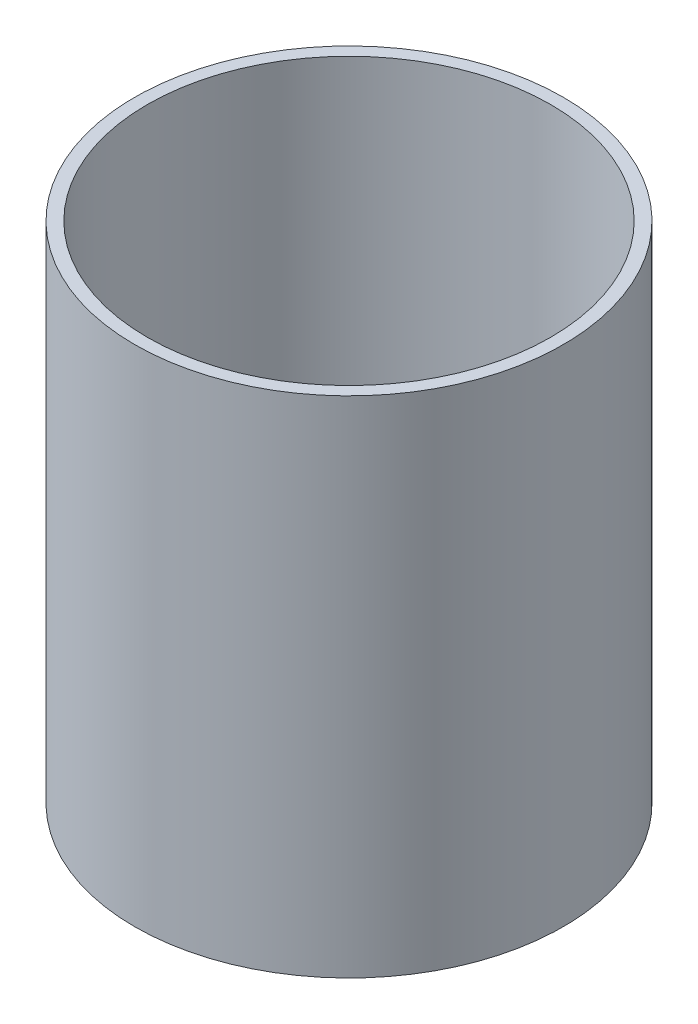
ISO-10303-21;
HEADER;
FILE_DESCRIPTION(('STEP AP214'),'2;1');
FILE_NAME('part.step','',(''),(''),'','','');
FILE_SCHEMA(('AUTOMOTIVE_DESIGN { 1 0 10303 214 1 1 1 1 }'));
ENDSEC;
DATA;
#1=APPLICATION_CONTEXT('core data for automotive mechanical design processes');
#2=APPLICATION_PROTOCOL_DEFINITION('international standard','automotive_design',2000,#1);
#3=PRODUCT_CONTEXT('',#1,'mechanical');
#4=PRODUCT('Part','Part','',(#3));
#5=PRODUCT_RELATED_PRODUCT_CATEGORY('part','',(#4));
#6=PRODUCT_DEFINITION_FORMATION('','',#4);
#7=PRODUCT_DEFINITION_CONTEXT('part definition',#1,'design');
#8=PRODUCT_DEFINITION('design','',#6,#7);
#9=PRODUCT_DEFINITION_SHAPE('','',#8);
#10=(LENGTH_UNIT() NAMED_UNIT(*) SI_UNIT(.MILLI.,.METRE.));
#11=(NAMED_UNIT(*) PLANE_ANGLE_UNIT() SI_UNIT($,.RADIAN.));
#12=(NAMED_UNIT(*) SI_UNIT($,.STERADIAN.) SOLID_ANGLE_UNIT());
#13=UNCERTAINTY_MEASURE_WITH_UNIT(LENGTH_MEASURE(1.E-05),#10,'distance_accuracy_value','');
#14=(GEOMETRIC_REPRESENTATION_CONTEXT(3) GLOBAL_UNCERTAINTY_ASSIGNED_CONTEXT((#13)) GLOBAL_UNIT_ASSIGNED_CONTEXT((#10,
#11,#12)) REPRESENTATION_CONTEXT('',''));
#15=CARTESIAN_POINT('',(0.,0.,0.));
#16=DIRECTION('',(0.,0.,1.));
#17=DIRECTION('',(1.,0.,0.));
#18=AXIS2_PLACEMENT_3D('',#15,#16,#17);
#19=CARTESIAN_POINT('',(0.,254.,0.));
#20=DIRECTION('',(0.,1.,0.));
#21=DIRECTION('',(0.,0.,1.));
#22=AXIS2_PLACEMENT_3D('',#19,#20,#21);
#23=PLANE('',#22);
#24=CARTESIAN_POINT('',(0.,254.,0.));
#25=DIRECTION('',(0.,1.,0.));
#26=DIRECTION('',(0.,0.,1.));
#27=AXIS2_PLACEMENT_3D('',#24,#25,#26);
#28=CIRCLE('',#27,107.95);
#29=CARTESIAN_POINT('',(0.,254.,107.95));
#30=VERTEX_POINT('',#29);
#31=EDGE_CURVE('E10',#30,#30,#28,.T.);
#32=ORIENTED_EDGE('',*,*,#31,.T.);
#33=EDGE_LOOP('',(#32));
#34=FACE_BOUND('',#33,.T.);
#35=CARTESIAN_POINT('',(0.,254.,0.));
#36=DIRECTION('',(0.,1.,0.));
#37=DIRECTION('',(0.,0.,1.));
#38=AXIS2_PLACEMENT_3D('',#35,#36,#37);
#39=CIRCLE('',#38,101.6);
#40=CARTESIAN_POINT('',(0.,254.,101.6));
#41=VERTEX_POINT('',#40);
#42=EDGE_CURVE('E54',#41,#41,#39,.T.);
#43=ORIENTED_EDGE('',*,*,#42,.F.);
#44=EDGE_LOOP('',(#43));
#45=FACE_BOUND('',#44,.T.);
#46=ADVANCED_FACE('F41',(#34,#45),#23,.T.);
#47=CARTESIAN_POINT('',(0.,0.,0.));
#48=DIRECTION('',(0.,1.,0.));
#49=DIRECTION('',(0.,0.,1.));
#50=AXIS2_PLACEMENT_3D('',#47,#48,#49);
#51=PLANE('',#50);
#52=CARTESIAN_POINT('',(0.,0.,0.));
#53=DIRECTION('',(0.,1.,0.));
#54=DIRECTION('',(0.,0.,1.));
#55=AXIS2_PLACEMENT_3D('',#52,#53,#54);
#56=CIRCLE('',#55,107.95);
#57=CARTESIAN_POINT('',(0.,0.,107.95));
#58=VERTEX_POINT('',#57);
#59=EDGE_CURVE('E45',#58,#58,#56,.T.);
#60=ORIENTED_EDGE('',*,*,#59,.F.);
#61=EDGE_LOOP('',(#60));
#62=FACE_BOUND('',#61,.T.);
#63=CARTESIAN_POINT('',(0.,0.,0.));
#64=DIRECTION('',(0.,1.,0.));
#65=DIRECTION('',(0.,0.,1.));
#66=AXIS2_PLACEMENT_3D('',#63,#64,#65);
#67=CIRCLE('',#66,101.6);
#68=CARTESIAN_POINT('',(0.,0.,101.6));
#69=VERTEX_POINT('',#68);
#70=EDGE_CURVE('E56',#69,#69,#67,.T.);
#71=ORIENTED_EDGE('',*,*,#70,.T.);
#72=EDGE_LOOP('',(#71));
#73=FACE_BOUND('',#72,.T.);
#74=ADVANCED_FACE('F68',(#62,#73),#51,.F.);
#75=CARTESIAN_POINT('',(0.,254.,0.));
#76=DIRECTION('',(0.,-1.,0.));
#77=DIRECTION('',(0.,0.,-1.));
#78=AXIS2_PLACEMENT_3D('',#75,#76,#77);
#79=CYLINDRICAL_SURFACE('',#78,107.95);
#80=ORIENTED_EDGE('',*,*,#31,.F.);
#81=EDGE_LOOP('',(#80));
#82=FACE_BOUND('',#81,.T.);
#83=ORIENTED_EDGE('',*,*,#59,.T.);
#84=EDGE_LOOP('',(#83));
#85=FACE_BOUND('',#84,.T.);
#86=ADVANCED_FACE('F43',(#82,#85),#79,.T.);
#87=CARTESIAN_POINT('',(0.,254.,0.));
#88=DIRECTION('',(0.,-1.,0.));
#89=DIRECTION('',(0.,0.,-1.));
#90=AXIS2_PLACEMENT_3D('',#87,#88,#89);
#91=CYLINDRICAL_SURFACE('',#90,101.6);
#92=ORIENTED_EDGE('',*,*,#42,.T.);
#93=EDGE_LOOP('',(#92));
#94=FACE_BOUND('',#93,.T.);
#95=ORIENTED_EDGE('',*,*,#70,.F.);
#96=EDGE_LOOP('',(#95));
#97=FACE_BOUND('',#96,.T.);
#98=ADVANCED_FACE('F64',(#94,#97),#91,.F.);
#99=CLOSED_SHELL('',(#46,#74,#86,#98));
#100=MANIFOLD_SOLID_BREP('B2',#99);
#101=ADVANCED_BREP_SHAPE_REPRESENTATION('',(#18,#100),#14);
#102=SHAPE_DEFINITION_REPRESENTATION(#9,#101);
ENDSEC;
END-ISO-10303-21;
